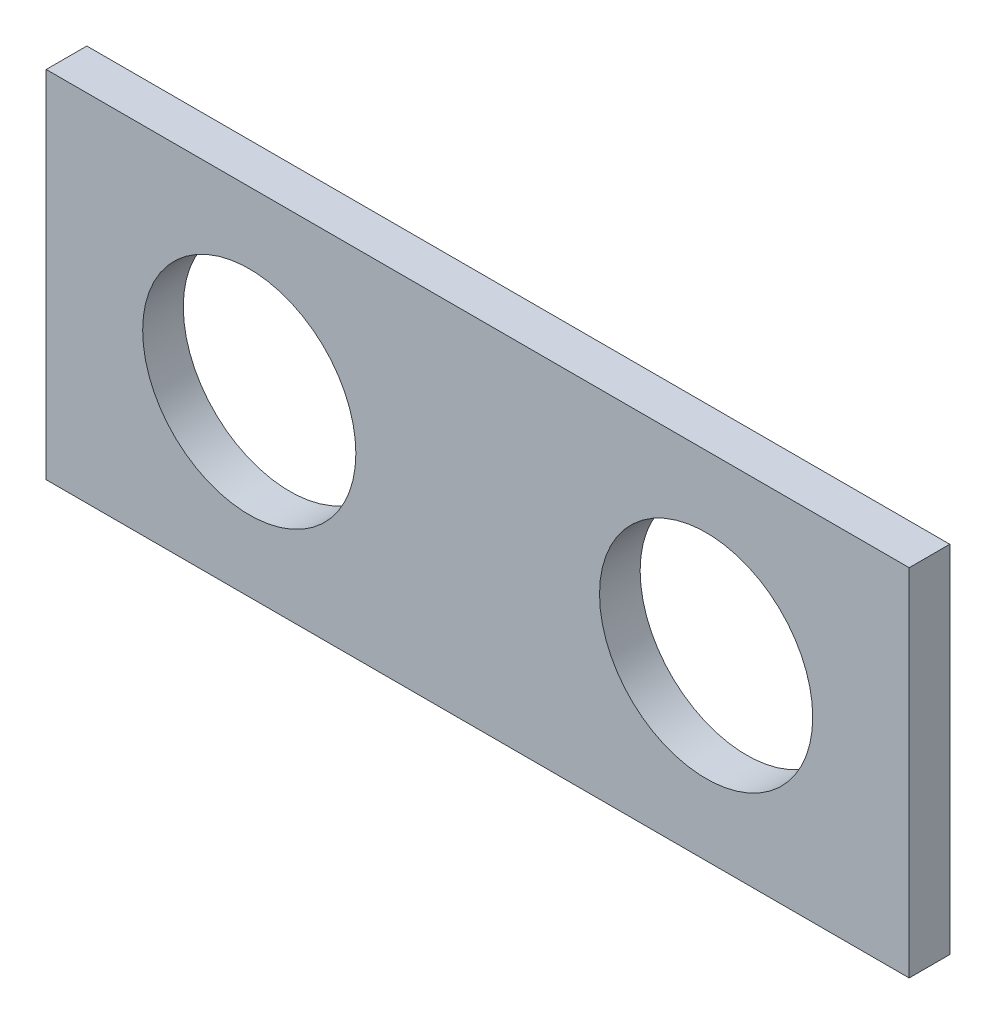
ISO-10303-21;
HEADER;
FILE_DESCRIPTION(('STEP AP214'),'2;1');
FILE_NAME('part.step','',(''),(''),'','','');
FILE_SCHEMA(('AUTOMOTIVE_DESIGN { 1 0 10303 214 1 1 1 1 }'));
ENDSEC;
DATA;
#1=APPLICATION_CONTEXT('core data for automotive mechanical design processes');
#2=APPLICATION_PROTOCOL_DEFINITION('international standard','automotive_design',2000,#1);
#3=PRODUCT_CONTEXT('',#1,'mechanical');
#4=PRODUCT('Part','Part','',(#3));
#5=PRODUCT_RELATED_PRODUCT_CATEGORY('part','',(#4));
#6=PRODUCT_DEFINITION_FORMATION('','',#4);
#7=PRODUCT_DEFINITION_CONTEXT('part definition',#1,'design');
#8=PRODUCT_DEFINITION('design','',#6,#7);
#9=PRODUCT_DEFINITION_SHAPE('','',#8);
#10=(LENGTH_UNIT() NAMED_UNIT(*) SI_UNIT(.MILLI.,.METRE.));
#11=(NAMED_UNIT(*) PLANE_ANGLE_UNIT() SI_UNIT($,.RADIAN.));
#12=(NAMED_UNIT(*) SI_UNIT($,.STERADIAN.) SOLID_ANGLE_UNIT());
#13=UNCERTAINTY_MEASURE_WITH_UNIT(LENGTH_MEASURE(1.E-05),#10,'distance_accuracy_value','');
#14=(GEOMETRIC_REPRESENTATION_CONTEXT(3) GLOBAL_UNCERTAINTY_ASSIGNED_CONTEXT((#13)) GLOBAL_UNIT_ASSIGNED_CONTEXT((#10,
#11,#12)) REPRESENTATION_CONTEXT('',''));
#15=CARTESIAN_POINT('',(0.,0.,0.));
#16=DIRECTION('',(0.,0.,1.));
#17=DIRECTION('',(1.,0.,0.));
#18=AXIS2_PLACEMENT_3D('',#15,#16,#17);
#19=CARTESIAN_POINT('',(0.,17.,-4.35));
#20=DIRECTION('',(0.,0.,1.));
#21=DIRECTION('',(1.,0.,0.));
#22=AXIS2_PLACEMENT_3D('',#19,#20,#21);
#23=PLANE('',#22);
#24=CARTESIAN_POINT('',(4.49999999999999,17.,-4.35));
#25=DIRECTION('',(0.,0.,-1.));
#26=DIRECTION('',(-1.,0.,0.));
#27=AXIS2_PLACEMENT_3D('',#24,#25,#26);
#28=CIRCLE('',#27,2.1);
#29=CARTESIAN_POINT('',(2.4,17.,-4.35));
#30=VERTEX_POINT('',#29);
#31=EDGE_CURVE('E84',#30,#30,#28,.F.);
#32=ORIENTED_EDGE('',*,*,#31,.T.);
#33=EDGE_LOOP('',(#32));
#34=FACE_BOUND('',#33,.T.);
#35=CARTESIAN_POINT('',(-4.5,17.,-4.35));
#36=DIRECTION('',(0.,0.,-1.));
#37=DIRECTION('',(-1.,0.,0.));
#38=AXIS2_PLACEMENT_3D('',#35,#36,#37);
#39=CIRCLE('',#38,2.1);
#40=CARTESIAN_POINT('',(-6.6,17.,-4.35));
#41=VERTEX_POINT('',#40);
#42=EDGE_CURVE('E20',#41,#41,#39,.F.);
#43=ORIENTED_EDGE('',*,*,#42,.T.);
#44=EDGE_LOOP('',(#43));
#45=FACE_BOUND('',#44,.T.);
#46=DIRECTION('',(1.,0.,0.));
#47=VECTOR('',#46,1.);
#48=CARTESIAN_POINT('',(-8.5,13.5,-4.35));
#49=LINE('',#48,#47);
#50=CARTESIAN_POINT('',(-8.5,13.5,-4.35));
#51=VERTEX_POINT('',#50);
#52=CARTESIAN_POINT('',(8.49999999999999,13.5,-4.35));
#53=VERTEX_POINT('',#52);
#54=EDGE_CURVE('E57',#51,#53,#49,.T.);
#55=ORIENTED_EDGE('',*,*,#54,.F.);
#56=DIRECTION('',(0.,1.,0.));
#57=VECTOR('',#56,1.);
#58=CARTESIAN_POINT('',(-8.5,20.5,-4.35));
#59=LINE('',#58,#57);
#60=CARTESIAN_POINT('',(-8.5,20.5,-4.35));
#61=VERTEX_POINT('',#60);
#62=EDGE_CURVE('E59',#61,#51,#59,.F.);
#63=ORIENTED_EDGE('',*,*,#62,.F.);
#64=DIRECTION('',(1.,0.,0.));
#65=VECTOR('',#64,1.);
#66=CARTESIAN_POINT('',(8.5,20.5,-4.35));
#67=LINE('',#66,#65);
#68=CARTESIAN_POINT('',(8.5,20.5,-4.35));
#69=VERTEX_POINT('',#68);
#70=EDGE_CURVE('E95',#69,#61,#67,.F.);
#71=ORIENTED_EDGE('',*,*,#70,.F.);
#72=DIRECTION('',(0.,1.,0.));
#73=VECTOR('',#72,1.);
#74=CARTESIAN_POINT('',(8.49999999999999,13.5,-4.35));
#75=LINE('',#74,#73);
#76=EDGE_CURVE('E55',#53,#69,#75,.T.);
#77=ORIENTED_EDGE('',*,*,#76,.F.);
#78=EDGE_LOOP('',(#55,#63,#71,#77));
#79=FACE_BOUND('',#78,.T.);
#80=ADVANCED_FACE('F17',(#34,#45,#79),#23,.F.);
#81=CARTESIAN_POINT('',(-8.5,20.5,-3.95));
#82=DIRECTION('',(-1.,0.,0.));
#83=DIRECTION('',(0.,0.,1.));
#84=AXIS2_PLACEMENT_3D('',#81,#82,#83);
#85=PLANE('',#84);
#86=DIRECTION('',(0.,1.,0.));
#87=VECTOR('',#86,1.);
#88=CARTESIAN_POINT('',(-8.5,17.,-3.55));
#89=LINE('',#88,#87);
#90=CARTESIAN_POINT('',(-8.5,20.5,-3.55));
#91=VERTEX_POINT('',#90);
#92=CARTESIAN_POINT('',(-8.5,13.5,-3.55));
#93=VERTEX_POINT('',#92);
#94=EDGE_CURVE('E86',#91,#93,#89,.F.);
#95=ORIENTED_EDGE('',*,*,#94,.F.);
#96=DIRECTION('',(0.,0.,1.));
#97=VECTOR('',#96,1.);
#98=CARTESIAN_POINT('',(-8.5,20.5,-3.95));
#99=LINE('',#98,#97);
#100=EDGE_CURVE('E70',#61,#91,#99,.T.);
#101=ORIENTED_EDGE('',*,*,#100,.F.);
#102=ORIENTED_EDGE('',*,*,#62,.T.);
#103=DIRECTION('',(0.,0.,-1.));
#104=VECTOR('',#103,1.);
#105=CARTESIAN_POINT('',(-8.5,13.5,-3.95));
#106=LINE('',#105,#104);
#107=EDGE_CURVE('E64',#93,#51,#106,.T.);
#108=ORIENTED_EDGE('',*,*,#107,.F.);
#109=EDGE_LOOP('',(#95,#101,#102,#108));
#110=FACE_BOUND('',#109,.T.);
#111=ADVANCED_FACE('F67',(#110),#85,.T.);
#112=CARTESIAN_POINT('',(-8.5,13.5,-3.95));
#113=DIRECTION('',(0.,-1.,0.));
#114=DIRECTION('',(0.,0.,-1.));
#115=AXIS2_PLACEMENT_3D('',#112,#113,#114);
#116=PLANE('',#115);
#117=DIRECTION('',(1.,0.,0.));
#118=VECTOR('',#117,1.);
#119=CARTESIAN_POINT('',(0.,13.5,-3.55));
#120=LINE('',#119,#118);
#121=CARTESIAN_POINT('',(8.49999999999999,13.5,-3.55));
#122=VERTEX_POINT('',#121);
#123=EDGE_CURVE('E75',#93,#122,#120,.T.);
#124=ORIENTED_EDGE('',*,*,#123,.F.);
#125=ORIENTED_EDGE('',*,*,#107,.T.);
#126=ORIENTED_EDGE('',*,*,#54,.T.);
#127=DIRECTION('',(0.,0.,-1.));
#128=VECTOR('',#127,1.);
#129=CARTESIAN_POINT('',(8.49999999999999,13.5,-3.95));
#130=LINE('',#129,#128);
#131=EDGE_CURVE('E78',#122,#53,#130,.T.);
#132=ORIENTED_EDGE('',*,*,#131,.F.);
#133=EDGE_LOOP('',(#124,#125,#126,#132));
#134=FACE_BOUND('',#133,.T.);
#135=ADVANCED_FACE('F73',(#134),#116,.T.);
#136=CARTESIAN_POINT('',(8.49999999999999,13.5,-3.95));
#137=DIRECTION('',(1.,0.,0.));
#138=DIRECTION('',(0.,0.,-1.));
#139=AXIS2_PLACEMENT_3D('',#136,#137,#138);
#140=PLANE('',#139);
#141=DIRECTION('',(0.,1.,0.));
#142=VECTOR('',#141,1.);
#143=CARTESIAN_POINT('',(8.49999999999999,17.,-3.55));
#144=LINE('',#143,#142);
#145=CARTESIAN_POINT('',(8.5,20.5,-3.55));
#146=VERTEX_POINT('',#145);
#147=EDGE_CURVE('E101',#122,#146,#144,.T.);
#148=ORIENTED_EDGE('',*,*,#147,.F.);
#149=ORIENTED_EDGE('',*,*,#131,.T.);
#150=ORIENTED_EDGE('',*,*,#76,.T.);
#151=DIRECTION('',(0.,0.,1.));
#152=VECTOR('',#151,1.);
#153=CARTESIAN_POINT('',(8.5,20.5,-3.95));
#154=LINE('',#153,#152);
#155=EDGE_CURVE('E35',#146,#69,#154,.F.);
#156=ORIENTED_EDGE('',*,*,#155,.F.);
#157=EDGE_LOOP('',(#148,#149,#150,#156));
#158=FACE_BOUND('',#157,.T.);
#159=ADVANCED_FACE('F99',(#158),#140,.T.);
#160=CARTESIAN_POINT('',(8.5,20.5,-3.95));
#161=DIRECTION('',(0.,1.,0.));
#162=DIRECTION('',(0.,0.,1.));
#163=AXIS2_PLACEMENT_3D('',#160,#161,#162);
#164=PLANE('',#163);
#165=DIRECTION('',(1.,0.,0.));
#166=VECTOR('',#165,1.);
#167=CARTESIAN_POINT('',(0.,20.5,-3.55));
#168=LINE('',#167,#166);
#169=EDGE_CURVE('E83',#146,#91,#168,.F.);
#170=ORIENTED_EDGE('',*,*,#169,.F.);
#171=ORIENTED_EDGE('',*,*,#155,.T.);
#172=ORIENTED_EDGE('',*,*,#70,.T.);
#173=ORIENTED_EDGE('',*,*,#100,.T.);
#174=EDGE_LOOP('',(#170,#171,#172,#173));
#175=FACE_BOUND('',#174,.T.);
#176=ADVANCED_FACE('F107',(#175),#164,.T.);
#177=CARTESIAN_POINT('',(-4.5,17.,-3.95));
#178=DIRECTION('',(0.,0.,-1.));
#179=DIRECTION('',(-1.,0.,0.));
#180=AXIS2_PLACEMENT_3D('',#177,#178,#179);
#181=CYLINDRICAL_SURFACE('',#180,2.1);
#182=ORIENTED_EDGE('',*,*,#42,.F.);
#183=EDGE_LOOP('',(#182));
#184=FACE_BOUND('',#183,.T.);
#185=CARTESIAN_POINT('',(-4.5,17.,-3.55));
#186=DIRECTION('',(0.,0.,-1.));
#187=DIRECTION('',(-1.,0.,0.));
#188=AXIS2_PLACEMENT_3D('',#185,#186,#187);
#189=CIRCLE('',#188,2.1);
#190=CARTESIAN_POINT('',(-6.6,17.,-3.55));
#191=VERTEX_POINT('',#190);
#192=EDGE_CURVE('E26',#191,#191,#189,.T.);
#193=ORIENTED_EDGE('',*,*,#192,.F.);
#194=EDGE_LOOP('',(#193));
#195=FACE_BOUND('',#194,.T.);
#196=ADVANCED_FACE('F109',(#184,#195),#181,.F.);
#197=CARTESIAN_POINT('',(4.49999999999999,17.,-3.95));
#198=DIRECTION('',(0.,0.,-1.));
#199=DIRECTION('',(-1.,0.,0.));
#200=AXIS2_PLACEMENT_3D('',#197,#198,#199);
#201=CYLINDRICAL_SURFACE('',#200,2.1);
#202=ORIENTED_EDGE('',*,*,#31,.F.);
#203=EDGE_LOOP('',(#202));
#204=FACE_BOUND('',#203,.T.);
#205=CARTESIAN_POINT('',(4.49999999999999,17.,-3.55));
#206=DIRECTION('',(0.,0.,-1.));
#207=DIRECTION('',(-1.,0.,0.));
#208=AXIS2_PLACEMENT_3D('',#205,#206,#207);
#209=CIRCLE('',#208,2.1);
#210=CARTESIAN_POINT('',(2.4,17.,-3.55));
#211=VERTEX_POINT('',#210);
#212=EDGE_CURVE('E11',#211,#211,#209,.T.);
#213=ORIENTED_EDGE('',*,*,#212,.F.);
#214=EDGE_LOOP('',(#213));
#215=FACE_BOUND('',#214,.T.);
#216=ADVANCED_FACE('F116',(#204,#215),#201,.F.);
#217=CARTESIAN_POINT('',(0.,17.,-3.55));
#218=DIRECTION('',(0.,0.,1.));
#219=DIRECTION('',(1.,0.,0.));
#220=AXIS2_PLACEMENT_3D('',#217,#218,#219);
#221=PLANE('',#220);
#222=ORIENTED_EDGE('',*,*,#212,.T.);
#223=EDGE_LOOP('',(#222));
#224=FACE_BOUND('',#223,.T.);
#225=ORIENTED_EDGE('',*,*,#192,.T.);
#226=EDGE_LOOP('',(#225));
#227=FACE_BOUND('',#226,.T.);
#228=ORIENTED_EDGE('',*,*,#147,.T.);
#229=ORIENTED_EDGE('',*,*,#169,.T.);
#230=ORIENTED_EDGE('',*,*,#94,.T.);
#231=ORIENTED_EDGE('',*,*,#123,.T.);
#232=EDGE_LOOP('',(#228,#229,#230,#231));
#233=FACE_BOUND('',#232,.T.);
#234=ADVANCED_FACE('F105',(#224,#227,#233),#221,.T.);
#235=CLOSED_SHELL('',(#80,#111,#135,#159,#176,#196,#216,#234));
#236=MANIFOLD_SOLID_BREP('B1',#235);
#237=ADVANCED_BREP_SHAPE_REPRESENTATION('',(#18,#236),#14);
#238=SHAPE_DEFINITION_REPRESENTATION(#9,#237);
ENDSEC;
END-ISO-10303-21;
